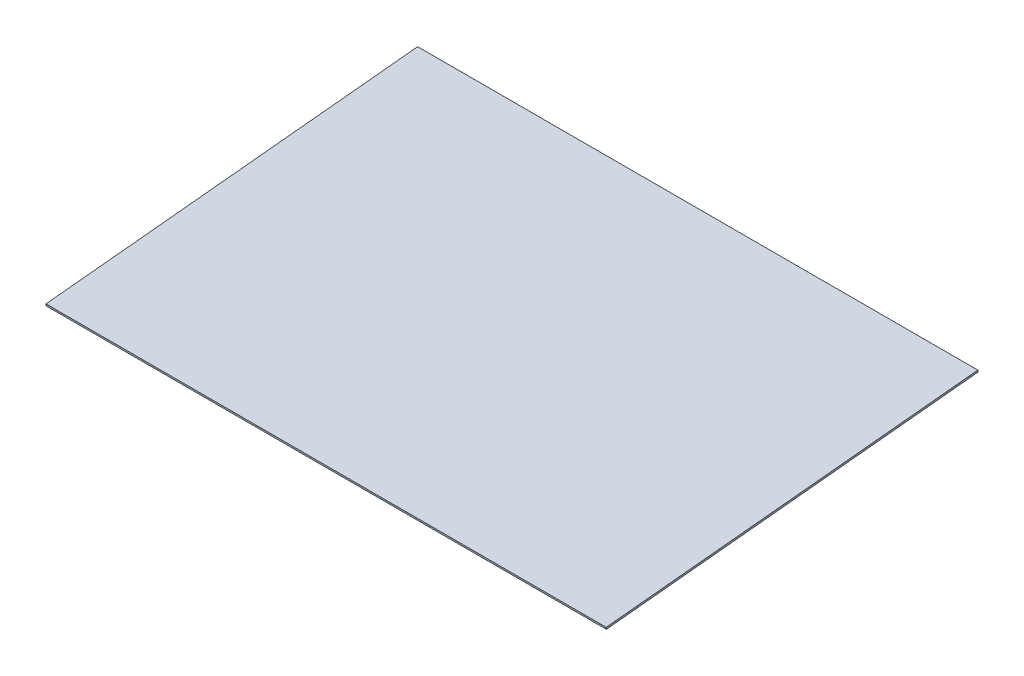
ISO-10303-21;
HEADER;
FILE_DESCRIPTION(('STEP AP214'),'2;1');
FILE_NAME('part.step','',(''),(''),'','','');
FILE_SCHEMA(('AUTOMOTIVE_DESIGN { 1 0 10303 214 1 1 1 1 }'));
ENDSEC;
DATA;
#1=APPLICATION_CONTEXT('core data for automotive mechanical design processes');
#2=APPLICATION_PROTOCOL_DEFINITION('international standard','automotive_design',2000,#1);
#3=PRODUCT_CONTEXT('',#1,'mechanical');
#4=PRODUCT('Part','Part','',(#3));
#5=PRODUCT_RELATED_PRODUCT_CATEGORY('part','',(#4));
#6=PRODUCT_DEFINITION_FORMATION('','',#4);
#7=PRODUCT_DEFINITION_CONTEXT('part definition',#1,'design');
#8=PRODUCT_DEFINITION('design','',#6,#7);
#9=PRODUCT_DEFINITION_SHAPE('','',#8);
#10=(LENGTH_UNIT() NAMED_UNIT(*) SI_UNIT(.MILLI.,.METRE.));
#11=(NAMED_UNIT(*) PLANE_ANGLE_UNIT() SI_UNIT($,.RADIAN.));
#12=(NAMED_UNIT(*) SI_UNIT($,.STERADIAN.) SOLID_ANGLE_UNIT());
#13=UNCERTAINTY_MEASURE_WITH_UNIT(LENGTH_MEASURE(1.E-05),#10,'distance_accuracy_value','');
#14=(GEOMETRIC_REPRESENTATION_CONTEXT(3) GLOBAL_UNCERTAINTY_ASSIGNED_CONTEXT((#13)) GLOBAL_UNIT_ASSIGNED_CONTEXT((#10,
#11,#12)) REPRESENTATION_CONTEXT('',''));
#15=CARTESIAN_POINT('',(0.,0.,0.));
#16=DIRECTION('',(0.,0.,1.));
#17=DIRECTION('',(1.,0.,0.));
#18=AXIS2_PLACEMENT_3D('',#15,#16,#17);
#19=CARTESIAN_POINT('',(0.,-15.6956241264367,7.68338165504172));
#20=DIRECTION('',(-1.,0.,0.));
#21=DIRECTION('',(0.,0.0989001242072341,-0.995097364799945));
#22=AXIS2_PLACEMENT_3D('',#19,#20,#21);
#23=PLANE('',#22);
#24=DIRECTION('',(0.,-0.995097364799944,-0.098900124207234));
#25=VECTOR('',#24,1.);
#26=CARTESIAN_POINT('',(0.,-17.6736266105814,27.5853289510406));
#27=LINE('',#26,#25);
#28=CARTESIAN_POINT('',(0.,-17.5741168741014,27.5952189634613));
#29=VERTEX_POINT('',#28);
#30=CARTESIAN_POINT('',(0.,-17.6736266105814,27.5853289510406));
#31=VERTEX_POINT('',#30);
#32=EDGE_CURVE('E11',#29,#31,#27,.T.);
#33=ORIENTED_EDGE('',*,*,#32,.F.);
#34=DIRECTION('',(0.,0.0989001242072341,-0.995097364799945));
#35=VECTOR('',#34,1.);
#36=CARTESIAN_POINT('',(0.,-15.5961143899567,7.69327166746244));
#37=LINE('',#36,#35);
#38=CARTESIAN_POINT('',(0.,-15.5961143899567,7.69327166746244));
#39=VERTEX_POINT('',#38);
#40=EDGE_CURVE('E88',#29,#39,#37,.T.);
#41=ORIENTED_EDGE('',*,*,#40,.T.);
#42=DIRECTION('',(0.,-0.995097364799944,-0.098900124207234));
#43=VECTOR('',#42,1.);
#44=CARTESIAN_POINT('',(0.,-15.6956241264367,7.68338165504172));
#45=LINE('',#44,#43);
#46=CARTESIAN_POINT('',(0.,-15.6956241264367,7.68338165504172));
#47=VERTEX_POINT('',#46);
#48=EDGE_CURVE('E43',#39,#47,#45,.T.);
#49=ORIENTED_EDGE('',*,*,#48,.T.);
#50=DIRECTION('',(0.,0.0989001242072341,-0.995097364799945));
#51=VECTOR('',#50,1.);
#52=CARTESIAN_POINT('',(0.,-15.6956241264367,7.68338165504172));
#53=LINE('',#52,#51);
#54=EDGE_CURVE('E101',#31,#47,#53,.T.);
#55=ORIENTED_EDGE('',*,*,#54,.F.);
#56=EDGE_LOOP('',(#33,#41,#49,#55));
#57=FACE_BOUND('',#56,.T.);
#58=ADVANCED_FACE('F33',(#57),#23,.T.);
#59=CARTESIAN_POINT('',(0.,-15.6956241264367,7.68338165504172));
#60=DIRECTION('',(0.,0.0989001242072341,-0.995097364799945));
#61=DIRECTION('',(1.,0.,0.));
#62=AXIS2_PLACEMENT_3D('',#59,#60,#61);
#63=PLANE('',#62);
#64=ORIENTED_EDGE('',*,*,#48,.F.);
#65=DIRECTION('',(1.,0.,0.));
#66=VECTOR('',#65,1.);
#67=CARTESIAN_POINT('',(0.,-15.5961143899567,7.69327166746244));
#68=LINE('',#67,#66);
#69=CARTESIAN_POINT('',(30.,-15.5961143899567,7.69327166746244));
#70=VERTEX_POINT('',#69);
#71=EDGE_CURVE('E95',#39,#70,#68,.T.);
#72=ORIENTED_EDGE('',*,*,#71,.T.);
#73=DIRECTION('',(0.,-0.995097364799944,-0.098900124207234));
#74=VECTOR('',#73,1.);
#75=CARTESIAN_POINT('',(30.,-15.6956241264367,7.68338165504172));
#76=LINE('',#75,#74);
#77=CARTESIAN_POINT('',(30.,-15.6956241264367,7.68338165504172));
#78=VERTEX_POINT('',#77);
#79=EDGE_CURVE('E51',#70,#78,#76,.T.);
#80=ORIENTED_EDGE('',*,*,#79,.T.);
#81=DIRECTION('',(1.,0.,0.));
#82=VECTOR('',#81,1.);
#83=CARTESIAN_POINT('',(0.,-15.6956241264367,7.68338165504172));
#84=LINE('',#83,#82);
#85=EDGE_CURVE('E82',#47,#78,#84,.T.);
#86=ORIENTED_EDGE('',*,*,#85,.F.);
#87=EDGE_LOOP('',(#64,#72,#80,#86));
#88=FACE_BOUND('',#87,.T.);
#89=ADVANCED_FACE('F105',(#88),#63,.T.);
#90=CARTESIAN_POINT('',(30.,-15.6956241264367,7.68338165504172));
#91=DIRECTION('',(-1.,0.,0.));
#92=DIRECTION('',(0.,0.0989001242072341,-0.995097364799945));
#93=AXIS2_PLACEMENT_3D('',#90,#91,#92);
#94=PLANE('',#93);
#95=ORIENTED_EDGE('',*,*,#79,.F.);
#96=DIRECTION('',(0.,0.0989001242072341,-0.995097364799945));
#97=VECTOR('',#96,1.);
#98=CARTESIAN_POINT('',(30.,-15.5961143899567,7.69327166746244));
#99=LINE('',#98,#97);
#100=CARTESIAN_POINT('',(30.,-17.5741168741014,27.5952189634613));
#101=VERTEX_POINT('',#100);
#102=EDGE_CURVE('E87',#101,#70,#99,.T.);
#103=ORIENTED_EDGE('',*,*,#102,.F.);
#104=DIRECTION('',(0.,-0.995097364799944,-0.098900124207234));
#105=VECTOR('',#104,1.);
#106=CARTESIAN_POINT('',(30.,-17.6736266105814,27.5853289510406));
#107=LINE('',#106,#105);
#108=CARTESIAN_POINT('',(30.,-17.6736266105814,27.5853289510406));
#109=VERTEX_POINT('',#108);
#110=EDGE_CURVE('E37',#101,#109,#107,.T.);
#111=ORIENTED_EDGE('',*,*,#110,.T.);
#112=DIRECTION('',(0.,0.0989001242072341,-0.995097364799945));
#113=VECTOR('',#112,1.);
#114=CARTESIAN_POINT('',(30.,-15.6956241264367,7.68338165504172));
#115=LINE('',#114,#113);
#116=EDGE_CURVE('E97',#109,#78,#115,.T.);
#117=ORIENTED_EDGE('',*,*,#116,.T.);
#118=EDGE_LOOP('',(#95,#103,#111,#117));
#119=FACE_BOUND('',#118,.T.);
#120=ADVANCED_FACE('F90',(#119),#94,.F.);
#121=CARTESIAN_POINT('',(0.,-17.6736266105814,27.5853289510406));
#122=DIRECTION('',(0.,0.0989001242072341,-0.995097364799945));
#123=DIRECTION('',(1.,0.,0.));
#124=AXIS2_PLACEMENT_3D('',#121,#122,#123);
#125=PLANE('',#124);
#126=DIRECTION('',(1.,0.,0.));
#127=VECTOR('',#126,1.);
#128=CARTESIAN_POINT('',(0.,-17.5741168741014,27.5952189634613));
#129=LINE('',#128,#127);
#130=EDGE_CURVE('E76',#29,#101,#129,.T.);
#131=ORIENTED_EDGE('',*,*,#130,.F.);
#132=ORIENTED_EDGE('',*,*,#32,.T.);
#133=DIRECTION('',(1.,0.,0.));
#134=VECTOR('',#133,1.);
#135=CARTESIAN_POINT('',(0.,-17.6736266105814,27.5853289510406));
#136=LINE('',#135,#134);
#137=EDGE_CURVE('E78',#31,#109,#136,.T.);
#138=ORIENTED_EDGE('',*,*,#137,.T.);
#139=ORIENTED_EDGE('',*,*,#110,.F.);
#140=EDGE_LOOP('',(#131,#132,#138,#139));
#141=FACE_BOUND('',#140,.T.);
#142=ADVANCED_FACE('F35',(#141),#125,.F.);
#143=CARTESIAN_POINT('',(0.,-15.6956241264367,7.68338165504172));
#144=DIRECTION('',(0.,-0.995097364799944,-0.098900124207234));
#145=DIRECTION('',(0.,0.0989001242072341,-0.995097364799945));
#146=AXIS2_PLACEMENT_3D('',#143,#144,#145);
#147=PLANE('',#146);
#148=ORIENTED_EDGE('',*,*,#116,.F.);
#149=ORIENTED_EDGE('',*,*,#137,.F.);
#150=ORIENTED_EDGE('',*,*,#54,.T.);
#151=ORIENTED_EDGE('',*,*,#85,.T.);
#152=EDGE_LOOP('',(#148,#149,#150,#151));
#153=FACE_BOUND('',#152,.T.);
#154=ADVANCED_FACE('F104',(#153),#147,.T.);
#155=CARTESIAN_POINT('',(0.,-15.5961143899567,7.69327166746244));
#156=DIRECTION('',(0.,-0.995097364799944,-0.098900124207234));
#157=DIRECTION('',(0.,0.0989001242072341,-0.995097364799945));
#158=AXIS2_PLACEMENT_3D('',#155,#156,#157);
#159=PLANE('',#158);
#160=ORIENTED_EDGE('',*,*,#102,.T.);
#161=ORIENTED_EDGE('',*,*,#71,.F.);
#162=ORIENTED_EDGE('',*,*,#40,.F.);
#163=ORIENTED_EDGE('',*,*,#130,.T.);
#164=EDGE_LOOP('',(#160,#161,#162,#163));
#165=FACE_BOUND('',#164,.T.);
#166=ADVANCED_FACE('F85',(#165),#159,.F.);
#167=CLOSED_SHELL('',(#58,#89,#120,#142,#154,#166));
#168=MANIFOLD_SOLID_BREP('B2',#167);
#169=ADVANCED_BREP_SHAPE_REPRESENTATION('',(#18,#168),#14);
#170=SHAPE_DEFINITION_REPRESENTATION(#9,#169);
ENDSEC;
END-ISO-10303-21;
